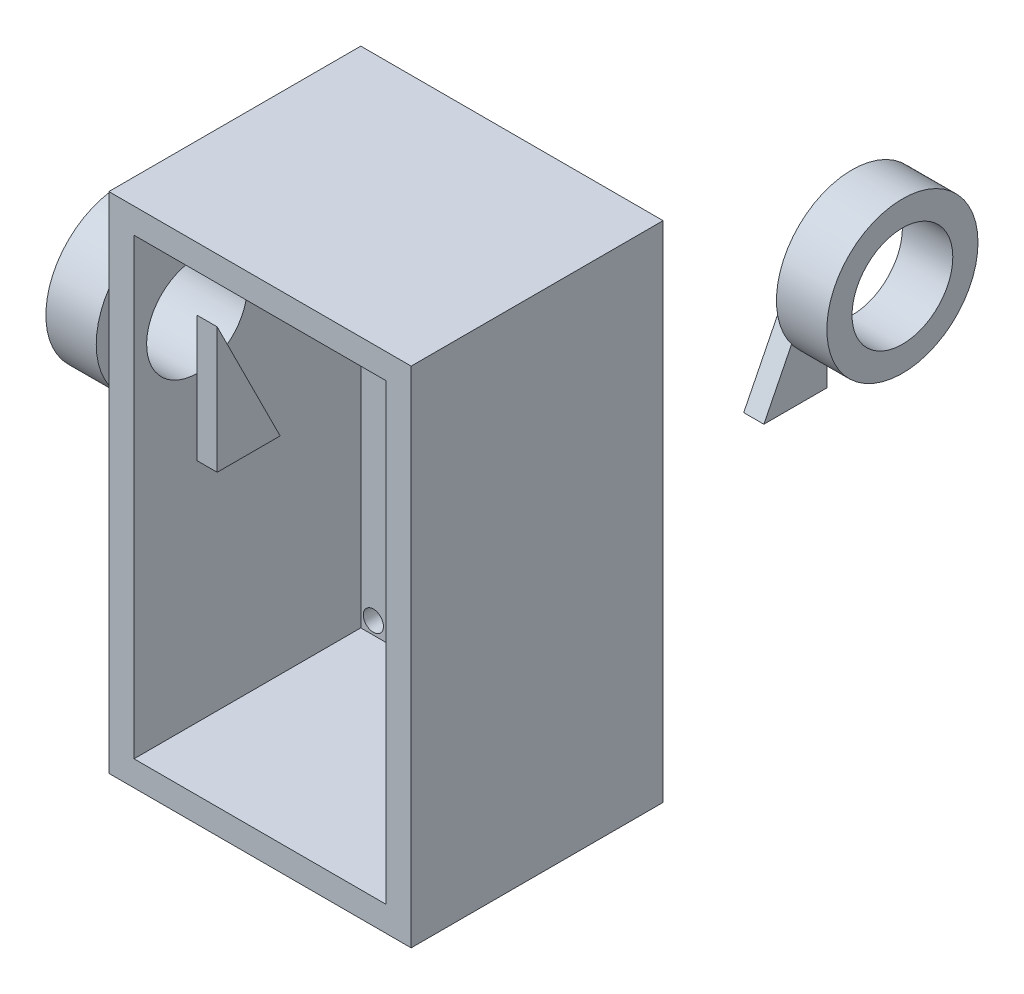
ISO-10303-21;
HEADER;
FILE_DESCRIPTION(('STEP AP214'),'2;1');
FILE_NAME('part.step','',(''),(''),'','','');
FILE_SCHEMA(('AUTOMOTIVE_DESIGN { 1 0 10303 214 1 1 1 1 }'));
ENDSEC;
DATA;
#1=APPLICATION_CONTEXT('core data for automotive mechanical design processes');
#2=APPLICATION_PROTOCOL_DEFINITION('international standard','automotive_design',2000,#1);
#3=PRODUCT_CONTEXT('',#1,'mechanical');
#4=PRODUCT('Part','Part','',(#3));
#5=PRODUCT_RELATED_PRODUCT_CATEGORY('part','',(#4));
#6=PRODUCT_DEFINITION_FORMATION('','',#4);
#7=PRODUCT_DEFINITION_CONTEXT('part definition',#1,'design');
#8=PRODUCT_DEFINITION('design','',#6,#7);
#9=PRODUCT_DEFINITION_SHAPE('','',#8);
#10=(LENGTH_UNIT() NAMED_UNIT(*) SI_UNIT(.MILLI.,.METRE.));
#11=(NAMED_UNIT(*) PLANE_ANGLE_UNIT() SI_UNIT($,.RADIAN.));
#12=(NAMED_UNIT(*) SI_UNIT($,.STERADIAN.) SOLID_ANGLE_UNIT());
#13=UNCERTAINTY_MEASURE_WITH_UNIT(LENGTH_MEASURE(1.E-05),#10,'distance_accuracy_value','');
#14=(GEOMETRIC_REPRESENTATION_CONTEXT(3) GLOBAL_UNCERTAINTY_ASSIGNED_CONTEXT((#13)) GLOBAL_UNIT_ASSIGNED_CONTEXT((#10,
#11,#12)) REPRESENTATION_CONTEXT('',''));
#15=CARTESIAN_POINT('',(0.,0.,0.));
#16=DIRECTION('',(0.,0.,1.));
#17=DIRECTION('',(1.,0.,0.));
#18=AXIS2_PLACEMENT_3D('',#15,#16,#17);
#19=CARTESIAN_POINT('',(42.,0.,-50.));
#20=DIRECTION('',(0.,0.447213595499958,0.894427190999916));
#21=DIRECTION('',(0.,-0.894427190999916,0.447213595499958));
#22=AXIS2_PLACEMENT_3D('',#19,#20,#21);
#23=PLANE('',#22);
#24=DIRECTION('',(0.,-0.894427190999916,0.447213595499958));
#25=VECTOR('',#24,1.);
#26=CARTESIAN_POINT('',(50.,0.,-50.));
#27=LINE('',#26,#25);
#28=CARTESIAN_POINT('',(50.,50.,-75.));
#29=VERTEX_POINT('',#28);
#30=CARTESIAN_POINT('',(50.,0.,-50.));
#31=VERTEX_POINT('',#30);
#32=EDGE_CURVE('E99',#29,#31,#27,.T.);
#33=ORIENTED_EDGE('',*,*,#32,.F.);
#34=DIRECTION('',(1.,0.,0.));
#35=VECTOR('',#34,1.);
#36=CARTESIAN_POINT('',(42.,50.,-75.));
#37=LINE('',#36,#35);
#38=CARTESIAN_POINT('',(42.,50.,-75.));
#39=VERTEX_POINT('',#38);
#40=EDGE_CURVE('E12',#39,#29,#37,.T.);
#41=ORIENTED_EDGE('',*,*,#40,.F.);
#42=DIRECTION('',(0.,-0.894427190999916,0.447213595499958));
#43=VECTOR('',#42,1.);
#44=CARTESIAN_POINT('',(42.,0.,-50.));
#45=LINE('',#44,#43);
#46=CARTESIAN_POINT('',(42.,0.,-50.));
#47=VERTEX_POINT('',#46);
#48=EDGE_CURVE('E95',#39,#47,#45,.T.);
#49=ORIENTED_EDGE('',*,*,#48,.T.);
#50=DIRECTION('',(1.,0.,0.));
#51=VECTOR('',#50,1.);
#52=CARTESIAN_POINT('',(42.,0.,-50.));
#53=LINE('',#52,#51);
#54=EDGE_CURVE('E51',#47,#31,#53,.T.);
#55=ORIENTED_EDGE('',*,*,#54,.T.);
#56=EDGE_LOOP('',(#33,#41,#49,#55));
#57=FACE_BOUND('',#56,.T.);
#58=ADVANCED_FACE('F48',(#57),#23,.T.);
#59=CARTESIAN_POINT('',(42.,50.,-75.));
#60=DIRECTION('',(0.,0.,-1.));
#61=DIRECTION('',(-1.,0.,0.));
#62=AXIS2_PLACEMENT_3D('',#59,#60,#61);
#63=PLANE('',#62);
#64=DIRECTION('',(0.,1.,0.));
#65=VECTOR('',#64,1.);
#66=CARTESIAN_POINT('',(50.,50.,-75.));
#67=LINE('',#66,#65);
#68=CARTESIAN_POINT('',(50.,0.,-75.));
#69=VERTEX_POINT('',#68);
#70=EDGE_CURVE('E94',#69,#29,#67,.T.);
#71=ORIENTED_EDGE('',*,*,#70,.F.);
#72=DIRECTION('',(1.,0.,0.));
#73=VECTOR('',#72,1.);
#74=CARTESIAN_POINT('',(42.,0.,-75.));
#75=LINE('',#74,#73);
#76=CARTESIAN_POINT('',(42.,0.,-75.));
#77=VERTEX_POINT('',#76);
#78=EDGE_CURVE('E60',#77,#69,#75,.T.);
#79=ORIENTED_EDGE('',*,*,#78,.F.);
#80=DIRECTION('',(0.,1.,0.));
#81=VECTOR('',#80,1.);
#82=CARTESIAN_POINT('',(42.,50.,-75.));
#83=LINE('',#82,#81);
#84=EDGE_CURVE('E90',#77,#39,#83,.T.);
#85=ORIENTED_EDGE('',*,*,#84,.T.);
#86=ORIENTED_EDGE('',*,*,#40,.T.);
#87=EDGE_LOOP('',(#71,#79,#85,#86));
#88=FACE_BOUND('',#87,.T.);
#89=ADVANCED_FACE('F102',(#88),#63,.T.);
#90=CARTESIAN_POINT('',(42.,0.,-75.));
#91=DIRECTION('',(0.,-1.,0.));
#92=DIRECTION('',(0.,0.,-1.));
#93=AXIS2_PLACEMENT_3D('',#90,#91,#92);
#94=PLANE('',#93);
#95=DIRECTION('',(0.,0.,-1.));
#96=VECTOR('',#95,1.);
#97=CARTESIAN_POINT('',(50.,0.,-75.));
#98=LINE('',#97,#96);
#99=EDGE_CURVE('E87',#31,#69,#98,.T.);
#100=ORIENTED_EDGE('',*,*,#99,.F.);
#101=ORIENTED_EDGE('',*,*,#54,.F.);
#102=DIRECTION('',(0.,0.,-1.));
#103=VECTOR('',#102,1.);
#104=CARTESIAN_POINT('',(42.,0.,-75.));
#105=LINE('',#104,#103);
#106=EDGE_CURVE('E83',#47,#77,#105,.T.);
#107=ORIENTED_EDGE('',*,*,#106,.T.);
#108=ORIENTED_EDGE('',*,*,#78,.T.);
#109=EDGE_LOOP('',(#100,#101,#107,#108));
#110=FACE_BOUND('',#109,.T.);
#111=ADVANCED_FACE('F81',(#110),#94,.T.);
#112=CARTESIAN_POINT('',(42.,0.,0.));
#113=DIRECTION('',(1.,0.,0.));
#114=DIRECTION('',(0.,0.,-1.));
#115=AXIS2_PLACEMENT_3D('',#112,#113,#114);
#116=PLANE('',#115);
#117=ORIENTED_EDGE('',*,*,#48,.F.);
#118=ORIENTED_EDGE('',*,*,#84,.F.);
#119=ORIENTED_EDGE('',*,*,#106,.F.);
#120=EDGE_LOOP('',(#117,#118,#119));
#121=FACE_BOUND('',#120,.T.);
#122=ADVANCED_FACE('F93',(#121),#116,.F.);
#123=CARTESIAN_POINT('',(50.,0.,0.));
#124=DIRECTION('',(1.,0.,0.));
#125=DIRECTION('',(0.,0.,-1.));
#126=AXIS2_PLACEMENT_3D('',#123,#124,#125);
#127=PLANE('',#126);
#128=ORIENTED_EDGE('',*,*,#32,.T.);
#129=ORIENTED_EDGE('',*,*,#99,.T.);
#130=ORIENTED_EDGE('',*,*,#70,.T.);
#131=EDGE_LOOP('',(#128,#129,#130));
#132=FACE_BOUND('',#131,.T.);
#133=ADVANCED_FACE('F103',(#132),#127,.T.);
#134=CLOSED_SHELL('',(#58,#89,#111,#122,#133));
#135=MANIFOLD_SOLID_BREP('B2',#134);
#136=CARTESIAN_POINT('',(80.,50.,-75.));
#137=DIRECTION('',(-1.,0.,0.));
#138=DIRECTION('',(0.,0.,1.));
#139=AXIS2_PLACEMENT_3D('',#136,#137,#138);
#140=CYLINDRICAL_SURFACE('',#139,30.);
#141=CARTESIAN_POINT('',(80.,50.,-75.));
#142=DIRECTION('',(1.,0.,0.));
#143=DIRECTION('',(0.,0.,-1.));
#144=AXIS2_PLACEMENT_3D('',#141,#142,#143);
#145=CIRCLE('',#144,30.);
#146=CARTESIAN_POINT('',(80.,50.,-105.));
#147=VERTEX_POINT('',#146);
#148=EDGE_CURVE('E50',#147,#147,#145,.T.);
#149=ORIENTED_EDGE('',*,*,#148,.F.);
#150=EDGE_LOOP('',(#149));
#151=FACE_BOUND('',#150,.T.);
#152=CARTESIAN_POINT('',(60.,50.,-75.));
#153=DIRECTION('',(1.,0.,0.));
#154=DIRECTION('',(0.,0.,-1.));
#155=AXIS2_PLACEMENT_3D('',#152,#153,#154);
#156=CIRCLE('',#155,30.);
#157=CARTESIAN_POINT('',(60.,50.,-105.));
#158=VERTEX_POINT('',#157);
#159=EDGE_CURVE('E165',#158,#158,#156,.T.);
#160=ORIENTED_EDGE('',*,*,#159,.T.);
#161=EDGE_LOOP('',(#160));
#162=FACE_BOUND('',#161,.T.);
#163=ADVANCED_FACE('F154',(#151,#162),#140,.T.);
#164=CARTESIAN_POINT('',(80.,50.,-75.));
#165=DIRECTION('',(1.,0.,0.));
#166=DIRECTION('',(0.,0.,-1.));
#167=AXIS2_PLACEMENT_3D('',#164,#165,#166);
#168=PLANE('',#167);
#169=CARTESIAN_POINT('',(80.,50.,-75.));
#170=DIRECTION('',(1.,0.,0.));
#171=DIRECTION('',(0.,0.,-1.));
#172=AXIS2_PLACEMENT_3D('',#169,#170,#171);
#173=CIRCLE('',#172,20.);
#174=CARTESIAN_POINT('',(80.,50.,-95.));
#175=VERTEX_POINT('',#174);
#176=EDGE_CURVE('E169',#175,#175,#173,.T.);
#177=ORIENTED_EDGE('',*,*,#176,.F.);
#178=EDGE_LOOP('',(#177));
#179=FACE_BOUND('',#178,.T.);
#180=ORIENTED_EDGE('',*,*,#148,.T.);
#181=EDGE_LOOP('',(#180));
#182=FACE_BOUND('',#181,.T.);
#183=ADVANCED_FACE('F184',(#179,#182),#168,.T.);
#184=CARTESIAN_POINT('',(60.,50.,-75.));
#185=DIRECTION('',(1.,0.,0.));
#186=DIRECTION('',(0.,0.,-1.));
#187=AXIS2_PLACEMENT_3D('',#184,#185,#186);
#188=PLANE('',#187);
#189=CARTESIAN_POINT('',(60.,50.,-75.));
#190=DIRECTION('',(1.,0.,0.));
#191=DIRECTION('',(0.,0.,-1.));
#192=AXIS2_PLACEMENT_3D('',#189,#190,#191);
#193=CIRCLE('',#192,20.);
#194=CARTESIAN_POINT('',(60.,50.,-95.));
#195=VERTEX_POINT('',#194);
#196=EDGE_CURVE('E158',#195,#195,#193,.T.);
#197=ORIENTED_EDGE('',*,*,#196,.T.);
#198=EDGE_LOOP('',(#197));
#199=FACE_BOUND('',#198,.T.);
#200=ORIENTED_EDGE('',*,*,#159,.F.);
#201=EDGE_LOOP('',(#200));
#202=FACE_BOUND('',#201,.T.);
#203=ADVANCED_FACE('F172',(#199,#202),#188,.F.);
#204=CARTESIAN_POINT('',(40.,50.,-75.));
#205=DIRECTION('',(1.,0.,0.));
#206=DIRECTION('',(0.,0.,-1.));
#207=AXIS2_PLACEMENT_3D('',#204,#205,#206);
#208=CYLINDRICAL_SURFACE('',#207,20.);
#209=ORIENTED_EDGE('',*,*,#176,.T.);
#210=EDGE_LOOP('',(#209));
#211=FACE_BOUND('',#210,.T.);
#212=ORIENTED_EDGE('',*,*,#196,.F.);
#213=EDGE_LOOP('',(#212));
#214=FACE_BOUND('',#213,.T.);
#215=ADVANCED_FACE('F179',(#211,#214),#208,.F.);
#216=CLOSED_SHELL('',(#163,#183,#203,#215));
#217=MANIFOLD_SOLID_BREP('B6',#216);
#218=CARTESIAN_POINT('',(-50.,-90.,9.99999999999999));
#219=DIRECTION('',(-1.,0.,0.));
#220=DIRECTION('',(0.,0.,1.));
#221=AXIS2_PLACEMENT_3D('',#218,#219,#220);
#222=PLANE('',#221);
#223=DIRECTION('',(0.,-1.,0.));
#224=VECTOR('',#223,1.);
#225=CARTESIAN_POINT('',(-50.,-90.,100.));
#226=LINE('',#225,#224);
#227=CARTESIAN_POINT('',(-50.,90.,100.));
#228=VERTEX_POINT('',#227);
#229=CARTESIAN_POINT('',(-50.,-90.,100.));
#230=VERTEX_POINT('',#229);
#231=EDGE_CURVE('E367',#228,#230,#226,.T.);
#232=ORIENTED_EDGE('',*,*,#231,.T.);
#233=DIRECTION('',(0.,0.,1.));
#234=VECTOR('',#233,1.);
#235=CARTESIAN_POINT('',(-50.,-90.,9.99999999999999));
#236=LINE('',#235,#234);
#237=CARTESIAN_POINT('',(-50.,-90.,9.99999999999999));
#238=VERTEX_POINT('',#237);
#239=EDGE_CURVE('E378',#238,#230,#236,.T.);
#240=ORIENTED_EDGE('',*,*,#239,.F.);
#241=DIRECTION('',(0.,-1.,0.));
#242=VECTOR('',#241,1.);
#243=CARTESIAN_POINT('',(-50.,-90.,9.99999999999999));
#244=LINE('',#243,#242);
#245=CARTESIAN_POINT('',(-50.,90.,9.99999999999999));
#246=VERTEX_POINT('',#245);
#247=EDGE_CURVE('E356',#246,#238,#244,.T.);
#248=ORIENTED_EDGE('',*,*,#247,.F.);
#249=DIRECTION('',(0.,0.,1.));
#250=VECTOR('',#249,1.);
#251=CARTESIAN_POINT('',(-50.,90.,9.99999999999999));
#252=LINE('',#251,#250);
#253=EDGE_CURVE('E379',#246,#228,#252,.T.);
#254=ORIENTED_EDGE('',*,*,#253,.T.);
#255=EDGE_LOOP('',(#232,#240,#248,#254));
#256=FACE_BOUND('',#255,.T.);
#257=DIRECTION('',(0.,0.894427190999916,0.447213595499958));
#258=VECTOR('',#257,1.);
#259=CARTESIAN_POINT('',(-50.,0.,50.));
#260=LINE('',#259,#258);
#261=CARTESIAN_POINT('',(-50.,0.,50.));
#262=VERTEX_POINT('',#261);
#263=CARTESIAN_POINT('',(-50.,32.1114561800017,66.0557280900008));
#264=VERTEX_POINT('',#263);
#265=EDGE_CURVE('E655',#262,#264,#260,.T.);
#266=ORIENTED_EDGE('',*,*,#265,.F.);
#267=DIRECTION('',(0.,0.,-1.));
#268=VECTOR('',#267,1.);
#269=CARTESIAN_POINT('',(-50.,0.,75.));
#270=LINE('',#269,#268);
#271=CARTESIAN_POINT('',(-50.,0.,75.));
#272=VERTEX_POINT('',#271);
#273=EDGE_CURVE('E231',#272,#262,#270,.T.);
#274=ORIENTED_EDGE('',*,*,#273,.F.);
#275=DIRECTION('',(0.,-1.,0.));
#276=VECTOR('',#275,1.);
#277=CARTESIAN_POINT('',(-50.,50.,75.));
#278=LINE('',#277,#276);
#279=CARTESIAN_POINT('',(-50.,30.,75.));
#280=VERTEX_POINT('',#279);
#281=EDGE_CURVE('E654',#280,#272,#278,.T.);
#282=ORIENTED_EDGE('',*,*,#281,.F.);
#283=CARTESIAN_POINT('',(-50.,50.,75.));
#284=DIRECTION('',(-1.,0.,0.));
#285=DIRECTION('',(0.,0.,1.));
#286=AXIS2_PLACEMENT_3D('',#283,#284,#285);
#287=CIRCLE('',#286,20.);
#288=EDGE_CURVE('E239',#264,#280,#287,.F.);
#289=ORIENTED_EDGE('',*,*,#288,.F.);
#290=EDGE_LOOP('',(#266,#274,#282,#289));
#291=FACE_BOUND('',#290,.T.);
#292=ADVANCED_FACE('F220',(#256,#291),#222,.F.);
#293=CARTESIAN_POINT('',(60.,-100.,100.));
#294=DIRECTION('',(-1.,0.,0.));
#295=DIRECTION('',(0.,0.,1.));
#296=AXIS2_PLACEMENT_3D('',#293,#294,#295);
#297=PLANE('',#296);
#298=DIRECTION('',(0.,1.,0.));
#299=VECTOR('',#298,1.);
#300=CARTESIAN_POINT('',(60.,-100.,0.));
#301=LINE('',#300,#299);
#302=CARTESIAN_POINT('',(60.,-100.,0.));
#303=VERTEX_POINT('',#302);
#304=CARTESIAN_POINT('',(60.,100.,0.));
#305=VERTEX_POINT('',#304);
#306=EDGE_CURVE('E380',#303,#305,#301,.T.);
#307=ORIENTED_EDGE('',*,*,#306,.T.);
#308=DIRECTION('',(0.,0.,-1.));
#309=VECTOR('',#308,1.);
#310=CARTESIAN_POINT('',(60.,100.,100.));
#311=LINE('',#310,#309);
#312=CARTESIAN_POINT('',(60.,100.,100.));
#313=VERTEX_POINT('',#312);
#314=EDGE_CURVE('E222',#313,#305,#311,.T.);
#315=ORIENTED_EDGE('',*,*,#314,.F.);
#316=DIRECTION('',(0.,1.,0.));
#317=VECTOR('',#316,1.);
#318=CARTESIAN_POINT('',(60.,-100.,100.));
#319=LINE('',#318,#317);
#320=CARTESIAN_POINT('',(60.,-100.,100.));
#321=VERTEX_POINT('',#320);
#322=EDGE_CURVE('E383',#321,#313,#319,.T.);
#323=ORIENTED_EDGE('',*,*,#322,.F.);
#324=DIRECTION('',(0.,0.,-1.));
#325=VECTOR('',#324,1.);
#326=CARTESIAN_POINT('',(60.,-100.,100.));
#327=LINE('',#326,#325);
#328=EDGE_CURVE('E400',#321,#303,#327,.T.);
#329=ORIENTED_EDGE('',*,*,#328,.T.);
#330=EDGE_LOOP('',(#307,#315,#323,#329));
#331=FACE_BOUND('',#330,.T.);
#332=ADVANCED_FACE('F218',(#331),#297,.F.);
#333=CARTESIAN_POINT('',(-60.,100.,100.));
#334=DIRECTION('',(0.,-1.,0.));
#335=DIRECTION('',(0.,0.,-1.));
#336=AXIS2_PLACEMENT_3D('',#333,#334,#335);
#337=PLANE('',#336);
#338=DIRECTION('',(-1.,0.,0.));
#339=VECTOR('',#338,1.);
#340=CARTESIAN_POINT('',(-60.,100.,0.));
#341=LINE('',#340,#339);
#342=CARTESIAN_POINT('',(-60.,100.,0.));
#343=VERTEX_POINT('',#342);
#344=EDGE_CURVE('E398',#305,#343,#341,.T.);
#345=ORIENTED_EDGE('',*,*,#344,.T.);
#346=DIRECTION('',(0.,0.,-1.));
#347=VECTOR('',#346,1.);
#348=CARTESIAN_POINT('',(-60.,100.,100.));
#349=LINE('',#348,#347);
#350=CARTESIAN_POINT('',(-60.,100.,100.));
#351=VERTEX_POINT('',#350);
#352=EDGE_CURVE('E409',#351,#343,#349,.T.);
#353=ORIENTED_EDGE('',*,*,#352,.F.);
#354=DIRECTION('',(-1.,0.,0.));
#355=VECTOR('',#354,1.);
#356=CARTESIAN_POINT('',(-60.,100.,100.));
#357=LINE('',#356,#355);
#358=EDGE_CURVE('E390',#313,#351,#357,.T.);
#359=ORIENTED_EDGE('',*,*,#358,.F.);
#360=ORIENTED_EDGE('',*,*,#314,.T.);
#361=EDGE_LOOP('',(#345,#353,#359,#360));
#362=FACE_BOUND('',#361,.T.);
#363=ADVANCED_FACE('F416',(#362),#337,.F.);
#364=CARTESIAN_POINT('',(-60.,-100.,100.));
#365=DIRECTION('',(1.,0.,0.));
#366=DIRECTION('',(0.,0.,-1.));
#367=AXIS2_PLACEMENT_3D('',#364,#365,#366);
#368=PLANE('',#367);
#369=DIRECTION('',(0.,-1.,0.));
#370=VECTOR('',#369,1.);
#371=CARTESIAN_POINT('',(-60.,-100.,100.));
#372=LINE('',#371,#370);
#373=CARTESIAN_POINT('',(-60.,33.416876048223,100.));
#374=VERTEX_POINT('',#373);
#375=CARTESIAN_POINT('',(-60.,-100.,100.));
#376=VERTEX_POINT('',#375);
#377=EDGE_CURVE('E388',#374,#376,#372,.T.);
#378=ORIENTED_EDGE('',*,*,#377,.F.);
#379=CARTESIAN_POINT('',(-60.,50.,75.));
#380=DIRECTION('',(1.,0.,0.));
#381=DIRECTION('',(0.,0.,-1.));
#382=AXIS2_PLACEMENT_3D('',#379,#380,#381);
#383=CIRCLE('',#382,30.);
#384=CARTESIAN_POINT('',(-60.,66.583123951777,100.));
#385=VERTEX_POINT('',#384);
#386=EDGE_CURVE('E153',#374,#385,#383,.T.);
#387=ORIENTED_EDGE('',*,*,#386,.T.);
#388=EDGE_CURVE('E393',#351,#385,#372,.T.);
#389=ORIENTED_EDGE('',*,*,#388,.F.);
#390=ORIENTED_EDGE('',*,*,#352,.T.);
#391=DIRECTION('',(0.,-1.,0.));
#392=VECTOR('',#391,1.);
#393=CARTESIAN_POINT('',(-60.,-100.,0.));
#394=LINE('',#393,#392);
#395=CARTESIAN_POINT('',(-60.,-100.,0.));
#396=VERTEX_POINT('',#395);
#397=EDGE_CURVE('E405',#343,#396,#394,.T.);
#398=ORIENTED_EDGE('',*,*,#397,.T.);
#399=DIRECTION('',(0.,0.,-1.));
#400=VECTOR('',#399,1.);
#401=CARTESIAN_POINT('',(-60.,-100.,100.));
#402=LINE('',#401,#400);
#403=EDGE_CURVE('E410',#376,#396,#402,.T.);
#404=ORIENTED_EDGE('',*,*,#403,.F.);
#405=EDGE_LOOP('',(#378,#387,#389,#390,#398,#404));
#406=FACE_BOUND('',#405,.T.);
#407=ADVANCED_FACE('F428',(#406),#368,.F.);
#408=CARTESIAN_POINT('',(-60.,-100.,100.));
#409=DIRECTION('',(0.,1.,0.));
#410=DIRECTION('',(0.,0.,1.));
#411=AXIS2_PLACEMENT_3D('',#408,#409,#410);
#412=PLANE('',#411);
#413=DIRECTION('',(1.,0.,0.));
#414=VECTOR('',#413,1.);
#415=CARTESIAN_POINT('',(-60.,-100.,0.));
#416=LINE('',#415,#414);
#417=EDGE_CURVE('E389',#396,#303,#416,.T.);
#418=ORIENTED_EDGE('',*,*,#417,.T.);
#419=ORIENTED_EDGE('',*,*,#328,.F.);
#420=DIRECTION('',(1.,0.,0.));
#421=VECTOR('',#420,1.);
#422=CARTESIAN_POINT('',(-60.,-100.,100.));
#423=LINE('',#422,#421);
#424=EDGE_CURVE('E394',#376,#321,#423,.T.);
#425=ORIENTED_EDGE('',*,*,#424,.F.);
#426=ORIENTED_EDGE('',*,*,#403,.T.);
#427=EDGE_LOOP('',(#418,#419,#425,#426));
#428=FACE_BOUND('',#427,.T.);
#429=ADVANCED_FACE('F431',(#428),#412,.F.);
#430=CARTESIAN_POINT('',(0.,0.,100.));
#431=DIRECTION('',(0.,0.,-1.));
#432=DIRECTION('',(-1.,0.,0.));
#433=AXIS2_PLACEMENT_3D('',#430,#431,#432);
#434=PLANE('',#433);
#435=DIRECTION('',(-1.,0.,0.));
#436=VECTOR('',#435,1.);
#437=CARTESIAN_POINT('',(-50.,90.,100.));
#438=LINE('',#437,#436);
#439=CARTESIAN_POINT('',(50.,90.,100.));
#440=VERTEX_POINT('',#439);
#441=EDGE_CURVE('E370',#440,#228,#438,.T.);
#442=ORIENTED_EDGE('',*,*,#441,.F.);
#443=DIRECTION('',(0.,1.,0.));
#444=VECTOR('',#443,1.);
#445=CARTESIAN_POINT('',(50.,-90.,100.));
#446=LINE('',#445,#444);
#447=CARTESIAN_POINT('',(50.,-90.,100.));
#448=VERTEX_POINT('',#447);
#449=EDGE_CURVE('E349',#448,#440,#446,.T.);
#450=ORIENTED_EDGE('',*,*,#449,.F.);
#451=DIRECTION('',(1.,0.,0.));
#452=VECTOR('',#451,1.);
#453=CARTESIAN_POINT('',(-50.,-90.,100.));
#454=LINE('',#453,#452);
#455=EDGE_CURVE('E357',#230,#448,#454,.T.);
#456=ORIENTED_EDGE('',*,*,#455,.F.);
#457=ORIENTED_EDGE('',*,*,#231,.F.);
#458=EDGE_LOOP('',(#442,#450,#456,#457));
#459=FACE_BOUND('',#458,.T.);
#460=ORIENTED_EDGE('',*,*,#322,.T.);
#461=ORIENTED_EDGE('',*,*,#358,.T.);
#462=ORIENTED_EDGE('',*,*,#388,.T.);
#463=EDGE_CURVE('E392',#385,#374,#372,.T.);
#464=ORIENTED_EDGE('',*,*,#463,.T.);
#465=ORIENTED_EDGE('',*,*,#377,.T.);
#466=ORIENTED_EDGE('',*,*,#424,.T.);
#467=EDGE_LOOP('',(#460,#461,#462,#464,#465,#466));
#468=FACE_BOUND('',#467,.T.);
#469=ADVANCED_FACE('F433',(#459,#468),#434,.F.);
#470=CARTESIAN_POINT('',(0.,0.,0.));
#471=DIRECTION('',(0.,0.,-1.));
#472=DIRECTION('',(-1.,0.,0.));
#473=AXIS2_PLACEMENT_3D('',#470,#471,#472);
#474=PLANE('',#473);
#475=CARTESIAN_POINT('',(-45.,85.,0.));
#476=DIRECTION('',(0.,0.,1.));
#477=DIRECTION('',(1.,0.,0.));
#478=AXIS2_PLACEMENT_3D('',#475,#476,#477);
#479=CIRCLE('',#478,4.00000000000001);
#480=CARTESIAN_POINT('',(-41.,85.,0.));
#481=VERTEX_POINT('',#480);
#482=EDGE_CURVE('E664',#481,#481,#479,.T.);
#483=ORIENTED_EDGE('',*,*,#482,.T.);
#484=EDGE_LOOP('',(#483));
#485=FACE_BOUND('',#484,.T.);
#486=CARTESIAN_POINT('',(45.,-85.,0.));
#487=DIRECTION('',(0.,0.,1.));
#488=DIRECTION('',(1.,0.,0.));
#489=AXIS2_PLACEMENT_3D('',#486,#487,#488);
#490=CIRCLE('',#489,4.00000000000001);
#491=CARTESIAN_POINT('',(49.,-85.,0.));
#492=VERTEX_POINT('',#491);
#493=EDGE_CURVE('E669',#492,#492,#490,.T.);
#494=ORIENTED_EDGE('',*,*,#493,.T.);
#495=EDGE_LOOP('',(#494));
#496=FACE_BOUND('',#495,.T.);
#497=CARTESIAN_POINT('',(-45.,-85.,0.));
#498=DIRECTION('',(0.,0.,1.));
#499=DIRECTION('',(1.,0.,0.));
#500=AXIS2_PLACEMENT_3D('',#497,#498,#499);
#501=CIRCLE('',#500,4.00000000000001);
#502=CARTESIAN_POINT('',(-41.,-85.,0.));
#503=VERTEX_POINT('',#502);
#504=EDGE_CURVE('E667',#503,#503,#501,.T.);
#505=ORIENTED_EDGE('',*,*,#504,.T.);
#506=EDGE_LOOP('',(#505));
#507=FACE_BOUND('',#506,.T.);
#508=CARTESIAN_POINT('',(45.,85.,0.));
#509=DIRECTION('',(0.,0.,1.));
#510=DIRECTION('',(1.,0.,0.));
#511=AXIS2_PLACEMENT_3D('',#508,#509,#510);
#512=CIRCLE('',#511,4.00000000000001);
#513=CARTESIAN_POINT('',(49.,85.,0.));
#514=VERTEX_POINT('',#513);
#515=EDGE_CURVE('E659',#514,#514,#512,.T.);
#516=ORIENTED_EDGE('',*,*,#515,.T.);
#517=EDGE_LOOP('',(#516));
#518=FACE_BOUND('',#517,.T.);
#519=ORIENTED_EDGE('',*,*,#306,.F.);
#520=ORIENTED_EDGE('',*,*,#417,.F.);
#521=ORIENTED_EDGE('',*,*,#397,.F.);
#522=ORIENTED_EDGE('',*,*,#344,.F.);
#523=EDGE_LOOP('',(#519,#520,#521,#522));
#524=FACE_BOUND('',#523,.T.);
#525=ADVANCED_FACE('F422',(#485,#496,#507,#518,#524),#474,.T.);
#526=CARTESIAN_POINT('',(50.,-90.,9.99999999999999));
#527=DIRECTION('',(1.,0.,0.));
#528=DIRECTION('',(0.,0.,-1.));
#529=AXIS2_PLACEMENT_3D('',#526,#527,#528);
#530=PLANE('',#529);
#531=ORIENTED_EDGE('',*,*,#449,.T.);
#532=DIRECTION('',(0.,0.,1.));
#533=VECTOR('',#532,1.);
#534=CARTESIAN_POINT('',(50.,90.,9.99999999999999));
#535=LINE('',#534,#533);
#536=CARTESIAN_POINT('',(50.,90.,9.99999999999999));
#537=VERTEX_POINT('',#536);
#538=EDGE_CURVE('E364',#537,#440,#535,.T.);
#539=ORIENTED_EDGE('',*,*,#538,.F.);
#540=DIRECTION('',(0.,1.,0.));
#541=VECTOR('',#540,1.);
#542=CARTESIAN_POINT('',(50.,-90.,9.99999999999999));
#543=LINE('',#542,#541);
#544=CARTESIAN_POINT('',(50.,-90.,9.99999999999999));
#545=VERTEX_POINT('',#544);
#546=EDGE_CURVE('E355',#545,#537,#543,.T.);
#547=ORIENTED_EDGE('',*,*,#546,.F.);
#548=DIRECTION('',(0.,0.,1.));
#549=VECTOR('',#548,1.);
#550=CARTESIAN_POINT('',(50.,-90.,9.99999999999999));
#551=LINE('',#550,#549);
#552=EDGE_CURVE('E374',#545,#448,#551,.T.);
#553=ORIENTED_EDGE('',*,*,#552,.T.);
#554=EDGE_LOOP('',(#531,#539,#547,#553));
#555=FACE_BOUND('',#554,.T.);
#556=ADVANCED_FACE('F466',(#555),#530,.F.);
#557=CARTESIAN_POINT('',(-50.,-90.,9.99999999999999));
#558=DIRECTION('',(0.,-1.,0.));
#559=DIRECTION('',(0.,0.,-1.));
#560=AXIS2_PLACEMENT_3D('',#557,#558,#559);
#561=PLANE('',#560);
#562=ORIENTED_EDGE('',*,*,#455,.T.);
#563=ORIENTED_EDGE('',*,*,#552,.F.);
#564=DIRECTION('',(1.,0.,0.));
#565=VECTOR('',#564,1.);
#566=CARTESIAN_POINT('',(-50.,-90.,9.99999999999999));
#567=LINE('',#566,#565);
#568=EDGE_CURVE('E362',#238,#545,#567,.T.);
#569=ORIENTED_EDGE('',*,*,#568,.F.);
#570=ORIENTED_EDGE('',*,*,#239,.T.);
#571=EDGE_LOOP('',(#562,#563,#569,#570));
#572=FACE_BOUND('',#571,.T.);
#573=ADVANCED_FACE('F462',(#572),#561,.F.);
#574=CARTESIAN_POINT('',(-50.,90.,9.99999999999999));
#575=DIRECTION('',(0.,1.,0.));
#576=DIRECTION('',(0.,0.,1.));
#577=AXIS2_PLACEMENT_3D('',#574,#575,#576);
#578=PLANE('',#577);
#579=ORIENTED_EDGE('',*,*,#441,.T.);
#580=ORIENTED_EDGE('',*,*,#253,.F.);
#581=DIRECTION('',(-1.,0.,0.));
#582=VECTOR('',#581,1.);
#583=CARTESIAN_POINT('',(-50.,90.,9.99999999999999));
#584=LINE('',#583,#582);
#585=EDGE_CURVE('E352',#537,#246,#584,.T.);
#586=ORIENTED_EDGE('',*,*,#585,.F.);
#587=ORIENTED_EDGE('',*,*,#538,.T.);
#588=EDGE_LOOP('',(#579,#580,#586,#587));
#589=FACE_BOUND('',#588,.T.);
#590=ADVANCED_FACE('F452',(#589),#578,.F.);
#591=CARTESIAN_POINT('',(0.,0.,9.99999999999999));
#592=DIRECTION('',(0.,0.,-1.));
#593=DIRECTION('',(-1.,0.,0.));
#594=AXIS2_PLACEMENT_3D('',#591,#592,#593);
#595=PLANE('',#594);
#596=CARTESIAN_POINT('',(-45.,85.,10.));
#597=DIRECTION('',(0.,0.,1.));
#598=DIRECTION('',(1.,0.,0.));
#599=AXIS2_PLACEMENT_3D('',#596,#597,#598);
#600=CIRCLE('',#599,4.00000000000001);
#601=CARTESIAN_POINT('',(-41.,85.,10.));
#602=VERTEX_POINT('',#601);
#603=EDGE_CURVE('E674',#602,#602,#600,.T.);
#604=ORIENTED_EDGE('',*,*,#603,.F.);
#605=EDGE_LOOP('',(#604));
#606=FACE_BOUND('',#605,.T.);
#607=CARTESIAN_POINT('',(45.,-85.,10.));
#608=DIRECTION('',(0.,0.,1.));
#609=DIRECTION('',(1.,0.,0.));
#610=AXIS2_PLACEMENT_3D('',#607,#608,#609);
#611=CIRCLE('',#610,4.00000000000001);
#612=CARTESIAN_POINT('',(49.,-85.,10.));
#613=VERTEX_POINT('',#612);
#614=EDGE_CURVE('E668',#613,#613,#611,.T.);
#615=ORIENTED_EDGE('',*,*,#614,.F.);
#616=EDGE_LOOP('',(#615));
#617=FACE_BOUND('',#616,.T.);
#618=CARTESIAN_POINT('',(-45.,-85.,10.));
#619=DIRECTION('',(0.,0.,1.));
#620=DIRECTION('',(1.,0.,0.));
#621=AXIS2_PLACEMENT_3D('',#618,#619,#620);
#622=CIRCLE('',#621,4.00000000000001);
#623=CARTESIAN_POINT('',(-41.,-85.,10.));
#624=VERTEX_POINT('',#623);
#625=EDGE_CURVE('E676',#624,#624,#622,.T.);
#626=ORIENTED_EDGE('',*,*,#625,.F.);
#627=EDGE_LOOP('',(#626));
#628=FACE_BOUND('',#627,.T.);
#629=CARTESIAN_POINT('',(45.,85.,10.));
#630=DIRECTION('',(0.,0.,1.));
#631=DIRECTION('',(1.,0.,0.));
#632=AXIS2_PLACEMENT_3D('',#629,#630,#631);
#633=CIRCLE('',#632,4.00000000000001);
#634=CARTESIAN_POINT('',(49.,85.,10.));
#635=VERTEX_POINT('',#634);
#636=EDGE_CURVE('E653',#635,#635,#633,.T.);
#637=ORIENTED_EDGE('',*,*,#636,.F.);
#638=EDGE_LOOP('',(#637));
#639=FACE_BOUND('',#638,.T.);
#640=ORIENTED_EDGE('',*,*,#546,.T.);
#641=ORIENTED_EDGE('',*,*,#585,.T.);
#642=ORIENTED_EDGE('',*,*,#247,.T.);
#643=ORIENTED_EDGE('',*,*,#568,.T.);
#644=EDGE_LOOP('',(#640,#641,#642,#643));
#645=FACE_BOUND('',#644,.T.);
#646=ADVANCED_FACE('F442',(#606,#617,#628,#639,#645),#595,.F.);
#647=CARTESIAN_POINT('',(-60.,50.,75.));
#648=DIRECTION('',(1.,0.,0.));
#649=DIRECTION('',(0.,0.,-1.));
#650=AXIS2_PLACEMENT_3D('',#647,#648,#649);
#651=PLANE('',#650);
#652=ORIENTED_EDGE('',*,*,#463,.F.);
#653=EDGE_CURVE('E230',#385,#374,#383,.T.);
#654=ORIENTED_EDGE('',*,*,#653,.T.);
#655=EDGE_LOOP('',(#652,#654));
#656=FACE_BOUND('',#655,.T.);
#657=ADVANCED_FACE('F438',(#656),#651,.T.);
#658=CARTESIAN_POINT('',(-80.,50.,75.));
#659=DIRECTION('',(1.,0.,0.));
#660=DIRECTION('',(0.,0.,-1.));
#661=AXIS2_PLACEMENT_3D('',#658,#659,#660);
#662=CYLINDRICAL_SURFACE('',#661,30.);
#663=CARTESIAN_POINT('',(-80.,50.,75.));
#664=DIRECTION('',(1.,0.,0.));
#665=DIRECTION('',(0.,0.,-1.));
#666=AXIS2_PLACEMENT_3D('',#663,#664,#665);
#667=CIRCLE('',#666,30.);
#668=CARTESIAN_POINT('',(-80.,50.,45.));
#669=VERTEX_POINT('',#668);
#670=EDGE_CURVE('E350',#669,#669,#667,.T.);
#671=ORIENTED_EDGE('',*,*,#670,.T.);
#672=EDGE_LOOP('',(#671));
#673=FACE_BOUND('',#672,.T.);
#674=ORIENTED_EDGE('',*,*,#653,.F.);
#675=ORIENTED_EDGE('',*,*,#386,.F.);
#676=EDGE_LOOP('',(#674,#675));
#677=FACE_BOUND('',#676,.T.);
#678=ADVANCED_FACE('F440',(#673,#677),#662,.T.);
#679=CARTESIAN_POINT('',(-80.,50.,75.));
#680=DIRECTION('',(1.,0.,0.));
#681=DIRECTION('',(0.,0.,-1.));
#682=AXIS2_PLACEMENT_3D('',#679,#680,#681);
#683=PLANE('',#682);
#684=CARTESIAN_POINT('',(-80.,50.,75.));
#685=DIRECTION('',(1.,0.,0.));
#686=DIRECTION('',(0.,0.,-1.));
#687=AXIS2_PLACEMENT_3D('',#684,#685,#686);
#688=CIRCLE('',#687,20.);
#689=CARTESIAN_POINT('',(-80.,50.,55.));
#690=VERTEX_POINT('',#689);
#691=EDGE_CURVE('E340',#690,#690,#688,.T.);
#692=ORIENTED_EDGE('',*,*,#691,.T.);
#693=EDGE_LOOP('',(#692));
#694=FACE_BOUND('',#693,.T.);
#695=ORIENTED_EDGE('',*,*,#670,.F.);
#696=EDGE_LOOP('',(#695));
#697=FACE_BOUND('',#696,.T.);
#698=ADVANCED_FACE('F450',(#694,#697),#683,.F.);
#699=CARTESIAN_POINT('',(-40.,50.,75.));
#700=DIRECTION('',(-1.,0.,0.));
#701=DIRECTION('',(0.,0.,1.));
#702=AXIS2_PLACEMENT_3D('',#699,#700,#701);
#703=CYLINDRICAL_SURFACE('',#702,20.);
#704=ORIENTED_EDGE('',*,*,#691,.F.);
#705=EDGE_LOOP('',(#704));
#706=FACE_BOUND('',#705,.T.);
#707=EDGE_CURVE('E343',#280,#264,#287,.F.);
#708=ORIENTED_EDGE('',*,*,#707,.T.);
#709=ORIENTED_EDGE('',*,*,#288,.T.);
#710=EDGE_LOOP('',(#708,#709));
#711=FACE_BOUND('',#710,.T.);
#712=ADVANCED_FACE('F608',(#706,#711),#703,.F.);
#713=CARTESIAN_POINT('',(-42.,0.,50.));
#714=DIRECTION('',(0.,-0.447213595499958,0.894427190999916));
#715=DIRECTION('',(0.,-0.894427190999916,-0.447213595499958));
#716=AXIS2_PLACEMENT_3D('',#713,#714,#715);
#717=PLANE('',#716);
#718=ORIENTED_EDGE('',*,*,#265,.T.);
#719=CARTESIAN_POINT('',(-50.,50.,75.));
#720=VERTEX_POINT('',#719);
#721=EDGE_CURVE('E333',#264,#720,#260,.T.);
#722=ORIENTED_EDGE('',*,*,#721,.T.);
#723=DIRECTION('',(-1.,0.,0.));
#724=VECTOR('',#723,1.);
#725=CARTESIAN_POINT('',(-42.,50.,75.));
#726=LINE('',#725,#724);
#727=CARTESIAN_POINT('',(-42.,50.,75.));
#728=VERTEX_POINT('',#727);
#729=EDGE_CURVE('E318',#728,#720,#726,.T.);
#730=ORIENTED_EDGE('',*,*,#729,.F.);
#731=DIRECTION('',(0.,0.894427190999916,0.447213595499958));
#732=VECTOR('',#731,1.);
#733=CARTESIAN_POINT('',(-42.,0.,50.));
#734=LINE('',#733,#732);
#735=CARTESIAN_POINT('',(-42.,0.,50.));
#736=VERTEX_POINT('',#735);
#737=EDGE_CURVE('E322',#736,#728,#734,.T.);
#738=ORIENTED_EDGE('',*,*,#737,.F.);
#739=DIRECTION('',(-1.,0.,0.));
#740=VECTOR('',#739,1.);
#741=CARTESIAN_POINT('',(-42.,0.,50.));
#742=LINE('',#741,#740);
#743=EDGE_CURVE('E342',#736,#262,#742,.T.);
#744=ORIENTED_EDGE('',*,*,#743,.T.);
#745=EDGE_LOOP('',(#718,#722,#730,#738,#744));
#746=FACE_BOUND('',#745,.T.);
#747=ADVANCED_FACE('F334',(#746),#717,.F.);
#748=CARTESIAN_POINT('',(-42.,50.,75.));
#749=DIRECTION('',(0.,0.,-1.));
#750=DIRECTION('',(-1.,0.,0.));
#751=AXIS2_PLACEMENT_3D('',#748,#749,#750);
#752=PLANE('',#751);
#753=EDGE_CURVE('E651',#720,#280,#278,.T.);
#754=ORIENTED_EDGE('',*,*,#753,.T.);
#755=ORIENTED_EDGE('',*,*,#281,.T.);
#756=DIRECTION('',(-1.,0.,0.));
#757=VECTOR('',#756,1.);
#758=CARTESIAN_POINT('',(-42.,0.,75.));
#759=LINE('',#758,#757);
#760=CARTESIAN_POINT('',(-42.,0.,75.));
#761=VERTEX_POINT('',#760);
#762=EDGE_CURVE('E319',#761,#272,#759,.T.);
#763=ORIENTED_EDGE('',*,*,#762,.F.);
#764=DIRECTION('',(0.,-1.,0.));
#765=VECTOR('',#764,1.);
#766=CARTESIAN_POINT('',(-42.,50.,75.));
#767=LINE('',#766,#765);
#768=EDGE_CURVE('E311',#728,#761,#767,.T.);
#769=ORIENTED_EDGE('',*,*,#768,.F.);
#770=ORIENTED_EDGE('',*,*,#729,.T.);
#771=EDGE_LOOP('',(#754,#755,#763,#769,#770));
#772=FACE_BOUND('',#771,.T.);
#773=ADVANCED_FACE('F316',(#772),#752,.F.);
#774=CARTESIAN_POINT('',(-42.,0.,75.));
#775=DIRECTION('',(0.,1.,0.));
#776=DIRECTION('',(0.,0.,1.));
#777=AXIS2_PLACEMENT_3D('',#774,#775,#776);
#778=PLANE('',#777);
#779=ORIENTED_EDGE('',*,*,#273,.T.);
#780=ORIENTED_EDGE('',*,*,#743,.F.);
#781=DIRECTION('',(0.,0.,-1.));
#782=VECTOR('',#781,1.);
#783=CARTESIAN_POINT('',(-42.,0.,75.));
#784=LINE('',#783,#782);
#785=EDGE_CURVE('E323',#761,#736,#784,.T.);
#786=ORIENTED_EDGE('',*,*,#785,.F.);
#787=ORIENTED_EDGE('',*,*,#762,.T.);
#788=EDGE_LOOP('',(#779,#780,#786,#787));
#789=FACE_BOUND('',#788,.T.);
#790=ADVANCED_FACE('F586',(#789),#778,.F.);
#791=CARTESIAN_POINT('',(-42.,0.,0.));
#792=DIRECTION('',(-1.,0.,0.));
#793=DIRECTION('',(0.,0.,1.));
#794=AXIS2_PLACEMENT_3D('',#791,#792,#793);
#795=PLANE('',#794);
#796=ORIENTED_EDGE('',*,*,#737,.T.);
#797=ORIENTED_EDGE('',*,*,#768,.T.);
#798=ORIENTED_EDGE('',*,*,#785,.T.);
#799=EDGE_LOOP('',(#796,#797,#798));
#800=FACE_BOUND('',#799,.T.);
#801=ADVANCED_FACE('F330',(#800),#795,.F.);
#802=CARTESIAN_POINT('',(-50.,0.,0.));
#803=DIRECTION('',(-1.,0.,0.));
#804=DIRECTION('',(0.,0.,1.));
#805=AXIS2_PLACEMENT_3D('',#802,#803,#804);
#806=PLANE('',#805);
#807=ORIENTED_EDGE('',*,*,#707,.F.);
#808=ORIENTED_EDGE('',*,*,#753,.F.);
#809=ORIENTED_EDGE('',*,*,#721,.F.);
#810=EDGE_LOOP('',(#807,#808,#809));
#811=FACE_BOUND('',#810,.T.);
#812=ADVANCED_FACE('F529',(#811),#806,.T.);
#813=CARTESIAN_POINT('',(45.,85.,10.));
#814=DIRECTION('',(0.,0.,-1.));
#815=DIRECTION('',(-1.,0.,0.));
#816=AXIS2_PLACEMENT_3D('',#813,#814,#815);
#817=CYLINDRICAL_SURFACE('',#816,4.00000000000001);
#818=ORIENTED_EDGE('',*,*,#636,.T.);
#819=EDGE_LOOP('',(#818));
#820=FACE_BOUND('',#819,.T.);
#821=ORIENTED_EDGE('',*,*,#515,.F.);
#822=EDGE_LOOP('',(#821));
#823=FACE_BOUND('',#822,.T.);
#824=ADVANCED_FACE('F537',(#820,#823),#817,.F.);
#825=CARTESIAN_POINT('',(-45.,-85.,10.));
#826=DIRECTION('',(0.,0.,-1.));
#827=DIRECTION('',(-1.,0.,0.));
#828=AXIS2_PLACEMENT_3D('',#825,#826,#827);
#829=CYLINDRICAL_SURFACE('',#828,4.00000000000001);
#830=ORIENTED_EDGE('',*,*,#625,.T.);
#831=EDGE_LOOP('',(#830));
#832=FACE_BOUND('',#831,.T.);
#833=ORIENTED_EDGE('',*,*,#504,.F.);
#834=EDGE_LOOP('',(#833));
#835=FACE_BOUND('',#834,.T.);
#836=ADVANCED_FACE('F543',(#832,#835),#829,.F.);
#837=CARTESIAN_POINT('',(45.,-85.,10.));
#838=DIRECTION('',(0.,0.,-1.));
#839=DIRECTION('',(-1.,0.,0.));
#840=AXIS2_PLACEMENT_3D('',#837,#838,#839);
#841=CYLINDRICAL_SURFACE('',#840,4.00000000000001);
#842=ORIENTED_EDGE('',*,*,#614,.T.);
#843=EDGE_LOOP('',(#842));
#844=FACE_BOUND('',#843,.T.);
#845=ORIENTED_EDGE('',*,*,#493,.F.);
#846=EDGE_LOOP('',(#845));
#847=FACE_BOUND('',#846,.T.);
#848=ADVANCED_FACE('F555',(#844,#847),#841,.F.);
#849=CARTESIAN_POINT('',(-45.,85.,10.));
#850=DIRECTION('',(0.,0.,-1.));
#851=DIRECTION('',(-1.,0.,0.));
#852=AXIS2_PLACEMENT_3D('',#849,#850,#851);
#853=CYLINDRICAL_SURFACE('',#852,4.00000000000001);
#854=ORIENTED_EDGE('',*,*,#603,.T.);
#855=EDGE_LOOP('',(#854));
#856=FACE_BOUND('',#855,.T.);
#857=ORIENTED_EDGE('',*,*,#482,.F.);
#858=EDGE_LOOP('',(#857));
#859=FACE_BOUND('',#858,.T.);
#860=ADVANCED_FACE('F562',(#856,#859),#853,.F.);
#861=CLOSED_SHELL('',(#292,#332,#363,#407,#429,#469,#525,#556,#573,#590,#646,#657,#678,#698,
#712,#747,#773,#790,#801,#812,#824,#836,#848,#860));
#862=MANIFOLD_SOLID_BREP('B45',#861);
#863=ADVANCED_BREP_SHAPE_REPRESENTATION('',(#18,#135,#217,#862),#14);
#864=SHAPE_DEFINITION_REPRESENTATION(#9,#863);
ENDSEC;
END-ISO-10303-21;
